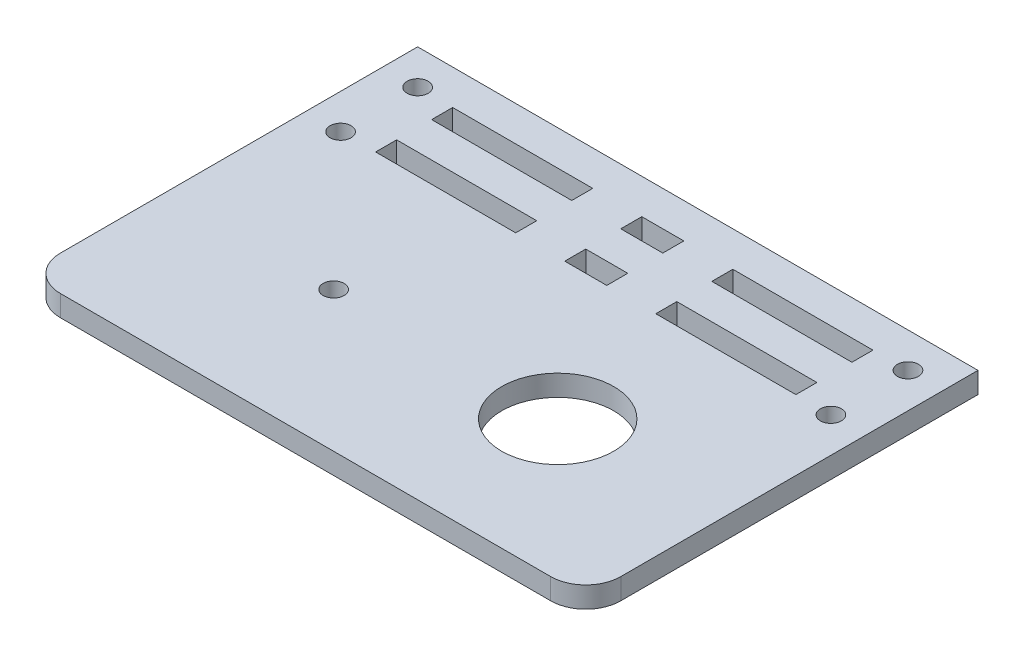
ISO-10303-21;
HEADER;
FILE_DESCRIPTION(('STEP AP214'),'2;1');
FILE_NAME('part.step','',(''),(''),'','','');
FILE_SCHEMA(('AUTOMOTIVE_DESIGN { 1 0 10303 214 1 1 1 1 }'));
ENDSEC;
DATA;
#1=APPLICATION_CONTEXT('core data for automotive mechanical design processes');
#2=APPLICATION_PROTOCOL_DEFINITION('international standard','automotive_design',2000,#1);
#3=PRODUCT_CONTEXT('',#1,'mechanical');
#4=PRODUCT('Part','Part','',(#3));
#5=PRODUCT_RELATED_PRODUCT_CATEGORY('part','',(#4));
#6=PRODUCT_DEFINITION_FORMATION('','',#4);
#7=PRODUCT_DEFINITION_CONTEXT('part definition',#1,'design');
#8=PRODUCT_DEFINITION('design','',#6,#7);
#9=PRODUCT_DEFINITION_SHAPE('','',#8);
#10=(LENGTH_UNIT() NAMED_UNIT(*) SI_UNIT(.MILLI.,.METRE.));
#11=(NAMED_UNIT(*) PLANE_ANGLE_UNIT() SI_UNIT($,.RADIAN.));
#12=(NAMED_UNIT(*) SI_UNIT($,.STERADIAN.) SOLID_ANGLE_UNIT());
#13=UNCERTAINTY_MEASURE_WITH_UNIT(LENGTH_MEASURE(1.E-05),#10,'distance_accuracy_value','');
#14=(GEOMETRIC_REPRESENTATION_CONTEXT(3) GLOBAL_UNCERTAINTY_ASSIGNED_CONTEXT((#13)) GLOBAL_UNIT_ASSIGNED_CONTEXT((#10,
#11,#12)) REPRESENTATION_CONTEXT('',''));
#15=CARTESIAN_POINT('',(0.,0.,0.));
#16=DIRECTION('',(0.,0.,1.));
#17=DIRECTION('',(1.,0.,0.));
#18=AXIS2_PLACEMENT_3D('',#15,#16,#17);
#19=CARTESIAN_POINT('',(-40.,3.,0.));
#20=DIRECTION('',(1.,0.,0.));
#21=DIRECTION('',(0.,0.,-1.));
#22=AXIS2_PLACEMENT_3D('',#19,#20,#21);
#23=PLANE('',#22);
#24=DIRECTION('',(0.,0.,1.));
#25=VECTOR('',#24,1.);
#26=CARTESIAN_POINT('',(-40.,0.,0.));
#27=LINE('',#26,#25);
#28=CARTESIAN_POINT('',(-40.,0.,-36.));
#29=VERTEX_POINT('',#28);
#30=CARTESIAN_POINT('',(-40.,0.,15.));
#31=VERTEX_POINT('',#30);
#32=EDGE_CURVE('E364',#29,#31,#27,.T.);
#33=ORIENTED_EDGE('',*,*,#32,.T.);
#34=DIRECTION('',(0.,-1.,0.));
#35=VECTOR('',#34,1.);
#36=CARTESIAN_POINT('',(-40.,3.,15.));
#37=LINE('',#36,#35);
#38=CARTESIAN_POINT('',(-40.,3.,15.));
#39=VERTEX_POINT('',#38);
#40=EDGE_CURVE('E11',#39,#31,#37,.T.);
#41=ORIENTED_EDGE('',*,*,#40,.F.);
#42=DIRECTION('',(0.,0.,1.));
#43=VECTOR('',#42,1.);
#44=CARTESIAN_POINT('',(-40.,3.,0.));
#45=LINE('',#44,#43);
#46=CARTESIAN_POINT('',(-40.,3.,-36.));
#47=VERTEX_POINT('',#46);
#48=EDGE_CURVE('E704',#47,#39,#45,.T.);
#49=ORIENTED_EDGE('',*,*,#48,.F.);
#50=DIRECTION('',(0.,-1.,0.));
#51=VECTOR('',#50,1.);
#52=CARTESIAN_POINT('',(-40.,3.,-36.));
#53=LINE('',#52,#51);
#54=EDGE_CURVE('E57',#47,#29,#53,.T.);
#55=ORIENTED_EDGE('',*,*,#54,.T.);
#56=EDGE_LOOP('',(#33,#41,#49,#55));
#57=FACE_BOUND('',#56,.T.);
#58=ADVANCED_FACE('F38',(#57),#23,.F.);
#59=CARTESIAN_POINT('',(-35.,3.,15.));
#60=DIRECTION('',(0.,-1.,0.));
#61=DIRECTION('',(0.,0.,-1.));
#62=AXIS2_PLACEMENT_3D('',#59,#60,#61);
#63=CYLINDRICAL_SURFACE('',#62,5.);
#64=CARTESIAN_POINT('',(-35.,0.,15.));
#65=DIRECTION('',(0.,1.,0.));
#66=DIRECTION('',(0.,0.,1.));
#67=AXIS2_PLACEMENT_3D('',#64,#65,#66);
#68=CIRCLE('',#67,5.);
#69=CARTESIAN_POINT('',(-35.,0.,20.));
#70=VERTEX_POINT('',#69);
#71=EDGE_CURVE('E366',#31,#70,#68,.T.);
#72=ORIENTED_EDGE('',*,*,#71,.T.);
#73=DIRECTION('',(0.,-1.,0.));
#74=VECTOR('',#73,1.);
#75=CARTESIAN_POINT('',(-35.,3.,20.));
#76=LINE('',#75,#74);
#77=CARTESIAN_POINT('',(-35.,3.,20.));
#78=VERTEX_POINT('',#77);
#79=EDGE_CURVE('E48',#78,#70,#76,.T.);
#80=ORIENTED_EDGE('',*,*,#79,.F.);
#81=CARTESIAN_POINT('',(-35.,3.,15.));
#82=DIRECTION('',(0.,1.,0.));
#83=DIRECTION('',(0.,0.,1.));
#84=AXIS2_PLACEMENT_3D('',#81,#82,#83);
#85=CIRCLE('',#84,5.);
#86=EDGE_CURVE('E705',#39,#78,#85,.T.);
#87=ORIENTED_EDGE('',*,*,#86,.F.);
#88=ORIENTED_EDGE('',*,*,#40,.T.);
#89=EDGE_LOOP('',(#72,#80,#87,#88));
#90=FACE_BOUND('',#89,.T.);
#91=ADVANCED_FACE('F463',(#90),#63,.T.);
#92=CARTESIAN_POINT('',(0.,3.,20.));
#93=DIRECTION('',(0.,0.,-1.));
#94=DIRECTION('',(-1.,0.,0.));
#95=AXIS2_PLACEMENT_3D('',#92,#93,#94);
#96=PLANE('',#95);
#97=DIRECTION('',(1.,0.,0.));
#98=VECTOR('',#97,1.);
#99=CARTESIAN_POINT('',(0.,0.,20.));
#100=LINE('',#99,#98);
#101=CARTESIAN_POINT('',(35.,0.,20.));
#102=VERTEX_POINT('',#101);
#103=EDGE_CURVE('E368',#70,#102,#100,.T.);
#104=ORIENTED_EDGE('',*,*,#103,.T.);
#105=DIRECTION('',(0.,-1.,0.));
#106=VECTOR('',#105,1.);
#107=CARTESIAN_POINT('',(35.,3.,20.));
#108=LINE('',#107,#106);
#109=CARTESIAN_POINT('',(35.,3.,20.));
#110=VERTEX_POINT('',#109);
#111=EDGE_CURVE('E265',#110,#102,#108,.T.);
#112=ORIENTED_EDGE('',*,*,#111,.F.);
#113=DIRECTION('',(1.,0.,0.));
#114=VECTOR('',#113,1.);
#115=CARTESIAN_POINT('',(0.,3.,20.));
#116=LINE('',#115,#114);
#117=EDGE_CURVE('E253',#78,#110,#116,.T.);
#118=ORIENTED_EDGE('',*,*,#117,.F.);
#119=ORIENTED_EDGE('',*,*,#79,.T.);
#120=EDGE_LOOP('',(#104,#112,#118,#119));
#121=FACE_BOUND('',#120,.T.);
#122=ADVANCED_FACE('F468',(#121),#96,.F.);
#123=CARTESIAN_POINT('',(35.,3.,15.));
#124=DIRECTION('',(0.,-1.,0.));
#125=DIRECTION('',(0.,0.,-1.));
#126=AXIS2_PLACEMENT_3D('',#123,#124,#125);
#127=CYLINDRICAL_SURFACE('',#126,5.);
#128=CARTESIAN_POINT('',(35.,0.,15.));
#129=DIRECTION('',(0.,1.,0.));
#130=DIRECTION('',(0.,0.,1.));
#131=AXIS2_PLACEMENT_3D('',#128,#129,#130);
#132=CIRCLE('',#131,5.);
#133=CARTESIAN_POINT('',(40.,0.,15.));
#134=VERTEX_POINT('',#133);
#135=EDGE_CURVE('E262',#102,#134,#132,.T.);
#136=ORIENTED_EDGE('',*,*,#135,.T.);
#137=DIRECTION('',(0.,-1.,0.));
#138=VECTOR('',#137,1.);
#139=CARTESIAN_POINT('',(40.,3.,15.));
#140=LINE('',#139,#138);
#141=CARTESIAN_POINT('',(40.,3.,15.));
#142=VERTEX_POINT('',#141);
#143=EDGE_CURVE('E259',#142,#134,#140,.T.);
#144=ORIENTED_EDGE('',*,*,#143,.F.);
#145=CARTESIAN_POINT('',(35.,3.,15.));
#146=DIRECTION('',(0.,1.,0.));
#147=DIRECTION('',(0.,0.,1.));
#148=AXIS2_PLACEMENT_3D('',#145,#146,#147);
#149=CIRCLE('',#148,5.);
#150=EDGE_CURVE('E244',#110,#142,#149,.T.);
#151=ORIENTED_EDGE('',*,*,#150,.F.);
#152=ORIENTED_EDGE('',*,*,#111,.T.);
#153=EDGE_LOOP('',(#136,#144,#151,#152));
#154=FACE_BOUND('',#153,.T.);
#155=ADVANCED_FACE('F260',(#154),#127,.T.);
#156=CARTESIAN_POINT('',(40.,3.,0.));
#157=DIRECTION('',(1.,0.,0.));
#158=DIRECTION('',(0.,0.,-1.));
#159=AXIS2_PLACEMENT_3D('',#156,#157,#158);
#160=PLANE('',#159);
#161=DIRECTION('',(0.,0.,1.));
#162=VECTOR('',#161,1.);
#163=CARTESIAN_POINT('',(40.,0.,0.));
#164=LINE('',#163,#162);
#165=CARTESIAN_POINT('',(40.,0.,-36.));
#166=VERTEX_POINT('',#165);
#167=EDGE_CURVE('E371',#166,#134,#164,.T.);
#168=ORIENTED_EDGE('',*,*,#167,.F.);
#169=DIRECTION('',(0.,-1.,0.));
#170=VECTOR('',#169,1.);
#171=CARTESIAN_POINT('',(40.,3.,-36.));
#172=LINE('',#171,#170);
#173=CARTESIAN_POINT('',(40.,3.,-36.));
#174=VERTEX_POINT('',#173);
#175=EDGE_CURVE('E149',#174,#166,#172,.T.);
#176=ORIENTED_EDGE('',*,*,#175,.F.);
#177=DIRECTION('',(0.,0.,1.));
#178=VECTOR('',#177,1.);
#179=CARTESIAN_POINT('',(40.,3.,0.));
#180=LINE('',#179,#178);
#181=EDGE_CURVE('E251',#174,#142,#180,.T.);
#182=ORIENTED_EDGE('',*,*,#181,.T.);
#183=ORIENTED_EDGE('',*,*,#143,.T.);
#184=EDGE_LOOP('',(#168,#176,#182,#183));
#185=FACE_BOUND('',#184,.T.);
#186=ADVANCED_FACE('F267',(#185),#160,.T.);
#187=CARTESIAN_POINT('',(0.,3.,-20.));
#188=DIRECTION('',(0.,0.,-1.));
#189=DIRECTION('',(-1.,0.,0.));
#190=AXIS2_PLACEMENT_3D('',#187,#188,#189);
#191=PLANE('',#190);
#192=DIRECTION('',(1.,0.,0.));
#193=VECTOR('',#192,1.);
#194=CARTESIAN_POINT('',(0.,0.,-20.));
#195=LINE('',#194,#193);
#196=CARTESIAN_POINT('',(10.,0.,-20.));
#197=VERTEX_POINT('',#196);
#198=CARTESIAN_POINT('',(30.,0.,-20.));
#199=VERTEX_POINT('',#198);
#200=EDGE_CURVE('E346',#197,#199,#195,.T.);
#201=ORIENTED_EDGE('',*,*,#200,.F.);
#202=DIRECTION('',(0.,-1.,0.));
#203=VECTOR('',#202,1.);
#204=CARTESIAN_POINT('',(10.,3.,-20.));
#205=LINE('',#204,#203);
#206=CARTESIAN_POINT('',(10.,3.,-20.));
#207=VERTEX_POINT('',#206);
#208=EDGE_CURVE('E381',#207,#197,#205,.T.);
#209=ORIENTED_EDGE('',*,*,#208,.F.);
#210=DIRECTION('',(1.,0.,0.));
#211=VECTOR('',#210,1.);
#212=CARTESIAN_POINT('',(0.,3.,-20.));
#213=LINE('',#212,#211);
#214=CARTESIAN_POINT('',(30.,3.,-20.));
#215=VERTEX_POINT('',#214);
#216=EDGE_CURVE('E723',#207,#215,#213,.T.);
#217=ORIENTED_EDGE('',*,*,#216,.T.);
#218=DIRECTION('',(0.,-1.,0.));
#219=VECTOR('',#218,1.);
#220=CARTESIAN_POINT('',(30.,3.,-20.));
#221=LINE('',#220,#219);
#222=EDGE_CURVE('E386',#215,#199,#221,.T.);
#223=ORIENTED_EDGE('',*,*,#222,.T.);
#224=EDGE_LOOP('',(#201,#209,#217,#223));
#225=FACE_BOUND('',#224,.T.);
#226=ADVANCED_FACE('F493',(#225),#191,.T.);
#227=CARTESIAN_POINT('',(10.,3.,0.));
#228=DIRECTION('',(1.,0.,0.));
#229=DIRECTION('',(0.,0.,-1.));
#230=AXIS2_PLACEMENT_3D('',#227,#228,#229);
#231=PLANE('',#230);
#232=DIRECTION('',(0.,0.,1.));
#233=VECTOR('',#232,1.);
#234=CARTESIAN_POINT('',(10.,0.,0.));
#235=LINE('',#234,#233);
#236=CARTESIAN_POINT('',(10.,0.,-23.));
#237=VERTEX_POINT('',#236);
#238=EDGE_CURVE('E349',#237,#197,#235,.T.);
#239=ORIENTED_EDGE('',*,*,#238,.F.);
#240=DIRECTION('',(0.,-1.,0.));
#241=VECTOR('',#240,1.);
#242=CARTESIAN_POINT('',(10.,3.,-23.));
#243=LINE('',#242,#241);
#244=CARTESIAN_POINT('',(10.,3.,-23.));
#245=VERTEX_POINT('',#244);
#246=EDGE_CURVE('E391',#245,#237,#243,.T.);
#247=ORIENTED_EDGE('',*,*,#246,.F.);
#248=DIRECTION('',(0.,0.,1.));
#249=VECTOR('',#248,1.);
#250=CARTESIAN_POINT('',(10.,3.,0.));
#251=LINE('',#250,#249);
#252=EDGE_CURVE('E720',#245,#207,#251,.T.);
#253=ORIENTED_EDGE('',*,*,#252,.T.);
#254=ORIENTED_EDGE('',*,*,#208,.T.);
#255=EDGE_LOOP('',(#239,#247,#253,#254));
#256=FACE_BOUND('',#255,.T.);
#257=ADVANCED_FACE('F489',(#256),#231,.T.);
#258=CARTESIAN_POINT('',(0.,3.,-23.));
#259=DIRECTION('',(0.,0.,1.));
#260=DIRECTION('',(1.,0.,0.));
#261=AXIS2_PLACEMENT_3D('',#258,#259,#260);
#262=PLANE('',#261);
#263=DIRECTION('',(-1.,0.,0.));
#264=VECTOR('',#263,1.);
#265=CARTESIAN_POINT('',(0.,0.,-23.));
#266=LINE('',#265,#264);
#267=CARTESIAN_POINT('',(30.,0.,-23.));
#268=VERTEX_POINT('',#267);
#269=EDGE_CURVE('E352',#268,#237,#266,.T.);
#270=ORIENTED_EDGE('',*,*,#269,.F.);
#271=DIRECTION('',(0.,-1.,0.));
#272=VECTOR('',#271,1.);
#273=CARTESIAN_POINT('',(30.,3.,-23.));
#274=LINE('',#273,#272);
#275=CARTESIAN_POINT('',(30.,3.,-23.));
#276=VERTEX_POINT('',#275);
#277=EDGE_CURVE('E388',#276,#268,#274,.T.);
#278=ORIENTED_EDGE('',*,*,#277,.F.);
#279=DIRECTION('',(-1.,0.,0.));
#280=VECTOR('',#279,1.);
#281=CARTESIAN_POINT('',(0.,3.,-23.));
#282=LINE('',#281,#280);
#283=EDGE_CURVE('E717',#276,#245,#282,.T.);
#284=ORIENTED_EDGE('',*,*,#283,.T.);
#285=ORIENTED_EDGE('',*,*,#246,.T.);
#286=EDGE_LOOP('',(#270,#278,#284,#285));
#287=FACE_BOUND('',#286,.T.);
#288=ADVANCED_FACE('F485',(#287),#262,.T.);
#289=CARTESIAN_POINT('',(0.,3.,-23.));
#290=DIRECTION('',(0.,0.,1.));
#291=DIRECTION('',(1.,0.,0.));
#292=AXIS2_PLACEMENT_3D('',#289,#290,#291);
#293=PLANE('',#292);
#294=DIRECTION('',(-1.,0.,0.));
#295=VECTOR('',#294,1.);
#296=CARTESIAN_POINT('',(0.,0.,-23.));
#297=LINE('',#296,#295);
#298=CARTESIAN_POINT('',(3.,0.,-23.));
#299=VERTEX_POINT('',#298);
#300=CARTESIAN_POINT('',(-3.,0.,-23.));
#301=VERTEX_POINT('',#300);
#302=EDGE_CURVE('E334',#299,#301,#297,.T.);
#303=ORIENTED_EDGE('',*,*,#302,.F.);
#304=DIRECTION('',(0.,-1.,0.));
#305=VECTOR('',#304,1.);
#306=CARTESIAN_POINT('',(3.,3.,-23.));
#307=LINE('',#306,#305);
#308=CARTESIAN_POINT('',(3.,3.,-23.));
#309=VERTEX_POINT('',#308);
#310=EDGE_CURVE('E389',#309,#299,#307,.T.);
#311=ORIENTED_EDGE('',*,*,#310,.F.);
#312=DIRECTION('',(-1.,0.,0.));
#313=VECTOR('',#312,1.);
#314=CARTESIAN_POINT('',(0.,3.,-23.));
#315=LINE('',#314,#313);
#316=CARTESIAN_POINT('',(-3.,3.,-23.));
#317=VERTEX_POINT('',#316);
#318=EDGE_CURVE('E735',#309,#317,#315,.T.);
#319=ORIENTED_EDGE('',*,*,#318,.T.);
#320=DIRECTION('',(0.,-1.,0.));
#321=VECTOR('',#320,1.);
#322=CARTESIAN_POINT('',(-3.,3.,-23.));
#323=LINE('',#322,#321);
#324=EDGE_CURVE('E394',#317,#301,#323,.T.);
#325=ORIENTED_EDGE('',*,*,#324,.T.);
#326=EDGE_LOOP('',(#303,#311,#319,#325));
#327=FACE_BOUND('',#326,.T.);
#328=ADVANCED_FACE('F488',(#327),#293,.T.);
#329=CARTESIAN_POINT('',(3.,3.,0.));
#330=DIRECTION('',(-1.,0.,0.));
#331=DIRECTION('',(0.,0.,1.));
#332=AXIS2_PLACEMENT_3D('',#329,#330,#331);
#333=PLANE('',#332);
#334=DIRECTION('',(0.,0.,-1.));
#335=VECTOR('',#334,1.);
#336=CARTESIAN_POINT('',(3.,0.,0.));
#337=LINE('',#336,#335);
#338=CARTESIAN_POINT('',(3.,0.,-20.));
#339=VERTEX_POINT('',#338);
#340=EDGE_CURVE('E337',#339,#299,#337,.T.);
#341=ORIENTED_EDGE('',*,*,#340,.F.);
#342=DIRECTION('',(0.,-1.,0.));
#343=VECTOR('',#342,1.);
#344=CARTESIAN_POINT('',(3.,3.,-20.));
#345=LINE('',#344,#343);
#346=CARTESIAN_POINT('',(3.,3.,-20.));
#347=VERTEX_POINT('',#346);
#348=EDGE_CURVE('E399',#347,#339,#345,.T.);
#349=ORIENTED_EDGE('',*,*,#348,.F.);
#350=DIRECTION('',(0.,0.,-1.));
#351=VECTOR('',#350,1.);
#352=CARTESIAN_POINT('',(3.,3.,0.));
#353=LINE('',#352,#351);
#354=EDGE_CURVE('E732',#347,#309,#353,.T.);
#355=ORIENTED_EDGE('',*,*,#354,.T.);
#356=ORIENTED_EDGE('',*,*,#310,.T.);
#357=EDGE_LOOP('',(#341,#349,#355,#356));
#358=FACE_BOUND('',#357,.T.);
#359=ADVANCED_FACE('F506',(#358),#333,.T.);
#360=CARTESIAN_POINT('',(0.,3.,-20.));
#361=DIRECTION('',(0.,0.,-1.));
#362=DIRECTION('',(-1.,0.,0.));
#363=AXIS2_PLACEMENT_3D('',#360,#361,#362);
#364=PLANE('',#363);
#365=DIRECTION('',(1.,0.,0.));
#366=VECTOR('',#365,1.);
#367=CARTESIAN_POINT('',(0.,0.,-20.));
#368=LINE('',#367,#366);
#369=CARTESIAN_POINT('',(-3.,0.,-20.));
#370=VERTEX_POINT('',#369);
#371=EDGE_CURVE('E340',#370,#339,#368,.T.);
#372=ORIENTED_EDGE('',*,*,#371,.F.);
#373=DIRECTION('',(0.,-1.,0.));
#374=VECTOR('',#373,1.);
#375=CARTESIAN_POINT('',(-3.,3.,-20.));
#376=LINE('',#375,#374);
#377=CARTESIAN_POINT('',(-3.,3.,-20.));
#378=VERTEX_POINT('',#377);
#379=EDGE_CURVE('E396',#378,#370,#376,.T.);
#380=ORIENTED_EDGE('',*,*,#379,.F.);
#381=DIRECTION('',(1.,0.,0.));
#382=VECTOR('',#381,1.);
#383=CARTESIAN_POINT('',(0.,3.,-20.));
#384=LINE('',#383,#382);
#385=EDGE_CURVE('E729',#378,#347,#384,.T.);
#386=ORIENTED_EDGE('',*,*,#385,.T.);
#387=ORIENTED_EDGE('',*,*,#348,.T.);
#388=EDGE_LOOP('',(#372,#380,#386,#387));
#389=FACE_BOUND('',#388,.T.);
#390=ADVANCED_FACE('F502',(#389),#364,.T.);
#391=CARTESIAN_POINT('',(0.,3.,-23.));
#392=DIRECTION('',(0.,0.,-1.));
#393=DIRECTION('',(-1.,0.,0.));
#394=AXIS2_PLACEMENT_3D('',#391,#392,#393);
#395=PLANE('',#394);
#396=DIRECTION('',(1.,0.,0.));
#397=VECTOR('',#396,1.);
#398=CARTESIAN_POINT('',(0.,0.,-23.));
#399=LINE('',#398,#397);
#400=CARTESIAN_POINT('',(-30.,0.,-23.));
#401=VERTEX_POINT('',#400);
#402=CARTESIAN_POINT('',(-10.,0.,-23.));
#403=VERTEX_POINT('',#402);
#404=EDGE_CURVE('E322',#401,#403,#399,.T.);
#405=ORIENTED_EDGE('',*,*,#404,.T.);
#406=DIRECTION('',(0.,-1.,0.));
#407=VECTOR('',#406,1.);
#408=CARTESIAN_POINT('',(-10.,3.,-23.));
#409=LINE('',#408,#407);
#410=CARTESIAN_POINT('',(-10.,3.,-23.));
#411=VERTEX_POINT('',#410);
#412=EDGE_CURVE('E397',#411,#403,#409,.T.);
#413=ORIENTED_EDGE('',*,*,#412,.F.);
#414=DIRECTION('',(1.,0.,0.));
#415=VECTOR('',#414,1.);
#416=CARTESIAN_POINT('',(0.,3.,-23.));
#417=LINE('',#416,#415);
#418=CARTESIAN_POINT('',(-30.,3.,-23.));
#419=VERTEX_POINT('',#418);
#420=EDGE_CURVE('E746',#419,#411,#417,.T.);
#421=ORIENTED_EDGE('',*,*,#420,.F.);
#422=DIRECTION('',(0.,-1.,0.));
#423=VECTOR('',#422,1.);
#424=CARTESIAN_POINT('',(-30.,3.,-23.));
#425=LINE('',#424,#423);
#426=EDGE_CURVE('E402',#419,#401,#425,.T.);
#427=ORIENTED_EDGE('',*,*,#426,.T.);
#428=EDGE_LOOP('',(#405,#413,#421,#427));
#429=FACE_BOUND('',#428,.T.);
#430=ADVANCED_FACE('F505',(#429),#395,.F.);
#431=CARTESIAN_POINT('',(-10.,3.,0.));
#432=DIRECTION('',(1.,0.,0.));
#433=DIRECTION('',(0.,0.,-1.));
#434=AXIS2_PLACEMENT_3D('',#431,#432,#433);
#435=PLANE('',#434);
#436=DIRECTION('',(0.,0.,1.));
#437=VECTOR('',#436,1.);
#438=CARTESIAN_POINT('',(-10.,0.,0.));
#439=LINE('',#438,#437);
#440=CARTESIAN_POINT('',(-10.,0.,-20.));
#441=VERTEX_POINT('',#440);
#442=EDGE_CURVE('E325',#403,#441,#439,.T.);
#443=ORIENTED_EDGE('',*,*,#442,.T.);
#444=DIRECTION('',(0.,-1.,0.));
#445=VECTOR('',#444,1.);
#446=CARTESIAN_POINT('',(-10.,3.,-20.));
#447=LINE('',#446,#445);
#448=CARTESIAN_POINT('',(-10.,3.,-20.));
#449=VERTEX_POINT('',#448);
#450=EDGE_CURVE('E407',#449,#441,#447,.T.);
#451=ORIENTED_EDGE('',*,*,#450,.F.);
#452=DIRECTION('',(0.,0.,1.));
#453=VECTOR('',#452,1.);
#454=CARTESIAN_POINT('',(-10.,3.,0.));
#455=LINE('',#454,#453);
#456=EDGE_CURVE('E744',#411,#449,#455,.T.);
#457=ORIENTED_EDGE('',*,*,#456,.F.);
#458=ORIENTED_EDGE('',*,*,#412,.T.);
#459=EDGE_LOOP('',(#443,#451,#457,#458));
#460=FACE_BOUND('',#459,.T.);
#461=ADVANCED_FACE('F522',(#460),#435,.F.);
#462=CARTESIAN_POINT('',(0.,3.,-20.));
#463=DIRECTION('',(0.,0.,-1.));
#464=DIRECTION('',(-1.,0.,0.));
#465=AXIS2_PLACEMENT_3D('',#462,#463,#464);
#466=PLANE('',#465);
#467=DIRECTION('',(1.,0.,0.));
#468=VECTOR('',#467,1.);
#469=CARTESIAN_POINT('',(0.,0.,-20.));
#470=LINE('',#469,#468);
#471=CARTESIAN_POINT('',(-30.,0.,-20.));
#472=VERTEX_POINT('',#471);
#473=EDGE_CURVE('E328',#472,#441,#470,.T.);
#474=ORIENTED_EDGE('',*,*,#473,.F.);
#475=DIRECTION('',(0.,-1.,0.));
#476=VECTOR('',#475,1.);
#477=CARTESIAN_POINT('',(-30.,3.,-20.));
#478=LINE('',#477,#476);
#479=CARTESIAN_POINT('',(-30.,3.,-20.));
#480=VERTEX_POINT('',#479);
#481=EDGE_CURVE('E404',#480,#472,#478,.T.);
#482=ORIENTED_EDGE('',*,*,#481,.F.);
#483=DIRECTION('',(1.,0.,0.));
#484=VECTOR('',#483,1.);
#485=CARTESIAN_POINT('',(0.,3.,-20.));
#486=LINE('',#485,#484);
#487=EDGE_CURVE('E741',#480,#449,#486,.T.);
#488=ORIENTED_EDGE('',*,*,#487,.T.);
#489=ORIENTED_EDGE('',*,*,#450,.T.);
#490=EDGE_LOOP('',(#474,#482,#488,#489));
#491=FACE_BOUND('',#490,.T.);
#492=ADVANCED_FACE('F518',(#491),#466,.T.);
#493=CARTESIAN_POINT('',(0.,3.,-28.));
#494=DIRECTION('',(0.,0.,-1.));
#495=DIRECTION('',(-1.,0.,0.));
#496=AXIS2_PLACEMENT_3D('',#493,#494,#495);
#497=PLANE('',#496);
#498=DIRECTION('',(1.,0.,0.));
#499=VECTOR('',#498,1.);
#500=CARTESIAN_POINT('',(0.,0.,-28.));
#501=LINE('',#500,#499);
#502=CARTESIAN_POINT('',(10.,0.,-28.));
#503=VERTEX_POINT('',#502);
#504=CARTESIAN_POINT('',(30.,0.,-28.));
#505=VERTEX_POINT('',#504);
#506=EDGE_CURVE('E310',#503,#505,#501,.T.);
#507=ORIENTED_EDGE('',*,*,#506,.F.);
#508=DIRECTION('',(0.,-1.,0.));
#509=VECTOR('',#508,1.);
#510=CARTESIAN_POINT('',(10.,3.,-28.));
#511=LINE('',#510,#509);
#512=CARTESIAN_POINT('',(10.,3.,-28.));
#513=VERTEX_POINT('',#512);
#514=EDGE_CURVE('E405',#513,#503,#511,.T.);
#515=ORIENTED_EDGE('',*,*,#514,.F.);
#516=DIRECTION('',(1.,0.,0.));
#517=VECTOR('',#516,1.);
#518=CARTESIAN_POINT('',(0.,3.,-28.));
#519=LINE('',#518,#517);
#520=CARTESIAN_POINT('',(30.,3.,-28.));
#521=VERTEX_POINT('',#520);
#522=EDGE_CURVE('E757',#513,#521,#519,.T.);
#523=ORIENTED_EDGE('',*,*,#522,.T.);
#524=DIRECTION('',(0.,-1.,0.));
#525=VECTOR('',#524,1.);
#526=CARTESIAN_POINT('',(30.,3.,-28.));
#527=LINE('',#526,#525);
#528=EDGE_CURVE('E411',#521,#505,#527,.T.);
#529=ORIENTED_EDGE('',*,*,#528,.T.);
#530=EDGE_LOOP('',(#507,#515,#523,#529));
#531=FACE_BOUND('',#530,.T.);
#532=ADVANCED_FACE('F521',(#531),#497,.T.);
#533=CARTESIAN_POINT('',(10.,3.,0.));
#534=DIRECTION('',(-1.,0.,0.));
#535=DIRECTION('',(0.,0.,1.));
#536=AXIS2_PLACEMENT_3D('',#533,#534,#535);
#537=PLANE('',#536);
#538=DIRECTION('',(0.,0.,-1.));
#539=VECTOR('',#538,1.);
#540=CARTESIAN_POINT('',(10.,0.,0.));
#541=LINE('',#540,#539);
#542=CARTESIAN_POINT('',(10.,0.,-31.));
#543=VERTEX_POINT('',#542);
#544=EDGE_CURVE('E313',#503,#543,#541,.T.);
#545=ORIENTED_EDGE('',*,*,#544,.T.);
#546=DIRECTION('',(0.,-1.,0.));
#547=VECTOR('',#546,1.);
#548=CARTESIAN_POINT('',(10.,3.,-31.));
#549=LINE('',#548,#547);
#550=CARTESIAN_POINT('',(10.,3.,-31.));
#551=VERTEX_POINT('',#550);
#552=EDGE_CURVE('E416',#551,#543,#549,.T.);
#553=ORIENTED_EDGE('',*,*,#552,.F.);
#554=DIRECTION('',(0.,0.,-1.));
#555=VECTOR('',#554,1.);
#556=CARTESIAN_POINT('',(10.,3.,0.));
#557=LINE('',#556,#555);
#558=EDGE_CURVE('E754',#513,#551,#557,.T.);
#559=ORIENTED_EDGE('',*,*,#558,.F.);
#560=ORIENTED_EDGE('',*,*,#514,.T.);
#561=EDGE_LOOP('',(#545,#553,#559,#560));
#562=FACE_BOUND('',#561,.T.);
#563=ADVANCED_FACE('F538',(#562),#537,.F.);
#564=CARTESIAN_POINT('',(0.,3.,-31.));
#565=DIRECTION('',(0.,0.,-1.));
#566=DIRECTION('',(-1.,0.,0.));
#567=AXIS2_PLACEMENT_3D('',#564,#565,#566);
#568=PLANE('',#567);
#569=DIRECTION('',(1.,0.,0.));
#570=VECTOR('',#569,1.);
#571=CARTESIAN_POINT('',(0.,0.,-31.));
#572=LINE('',#571,#570);
#573=CARTESIAN_POINT('',(30.,0.,-31.));
#574=VERTEX_POINT('',#573);
#575=EDGE_CURVE('E316',#543,#574,#572,.T.);
#576=ORIENTED_EDGE('',*,*,#575,.T.);
#577=DIRECTION('',(0.,-1.,0.));
#578=VECTOR('',#577,1.);
#579=CARTESIAN_POINT('',(30.,3.,-31.));
#580=LINE('',#579,#578);
#581=CARTESIAN_POINT('',(30.,3.,-31.));
#582=VERTEX_POINT('',#581);
#583=EDGE_CURVE('E413',#582,#574,#580,.T.);
#584=ORIENTED_EDGE('',*,*,#583,.F.);
#585=DIRECTION('',(1.,0.,0.));
#586=VECTOR('',#585,1.);
#587=CARTESIAN_POINT('',(0.,3.,-31.));
#588=LINE('',#587,#586);
#589=EDGE_CURVE('E752',#551,#582,#588,.T.);
#590=ORIENTED_EDGE('',*,*,#589,.F.);
#591=ORIENTED_EDGE('',*,*,#552,.T.);
#592=EDGE_LOOP('',(#576,#584,#590,#591));
#593=FACE_BOUND('',#592,.T.);
#594=ADVANCED_FACE('F534',(#593),#568,.F.);
#595=CARTESIAN_POINT('',(0.,3.,-28.));
#596=DIRECTION('',(0.,0.,1.));
#597=DIRECTION('',(1.,0.,0.));
#598=AXIS2_PLACEMENT_3D('',#595,#596,#597);
#599=PLANE('',#598);
#600=DIRECTION('',(-1.,0.,0.));
#601=VECTOR('',#600,1.);
#602=CARTESIAN_POINT('',(0.,0.,-28.));
#603=LINE('',#602,#601);
#604=CARTESIAN_POINT('',(-10.,0.,-28.));
#605=VERTEX_POINT('',#604);
#606=CARTESIAN_POINT('',(-30.,0.,-28.));
#607=VERTEX_POINT('',#606);
#608=EDGE_CURVE('E298',#605,#607,#603,.T.);
#609=ORIENTED_EDGE('',*,*,#608,.T.);
#610=DIRECTION('',(0.,-1.,0.));
#611=VECTOR('',#610,1.);
#612=CARTESIAN_POINT('',(-30.,3.,-28.));
#613=LINE('',#612,#611);
#614=CARTESIAN_POINT('',(-30.,3.,-28.));
#615=VERTEX_POINT('',#614);
#616=EDGE_CURVE('E414',#615,#607,#613,.T.);
#617=ORIENTED_EDGE('',*,*,#616,.F.);
#618=DIRECTION('',(-1.,0.,0.));
#619=VECTOR('',#618,1.);
#620=CARTESIAN_POINT('',(0.,3.,-28.));
#621=LINE('',#620,#619);
#622=CARTESIAN_POINT('',(-10.,3.,-28.));
#623=VERTEX_POINT('',#622);
#624=EDGE_CURVE('E768',#623,#615,#621,.T.);
#625=ORIENTED_EDGE('',*,*,#624,.F.);
#626=DIRECTION('',(0.,-1.,0.));
#627=VECTOR('',#626,1.);
#628=CARTESIAN_POINT('',(-10.,3.,-28.));
#629=LINE('',#628,#627);
#630=EDGE_CURVE('E420',#623,#605,#629,.T.);
#631=ORIENTED_EDGE('',*,*,#630,.T.);
#632=EDGE_LOOP('',(#609,#617,#625,#631));
#633=FACE_BOUND('',#632,.T.);
#634=ADVANCED_FACE('F537',(#633),#599,.F.);
#635=CARTESIAN_POINT('',(-30.,3.,0.));
#636=DIRECTION('',(-1.,0.,0.));
#637=DIRECTION('',(0.,0.,1.));
#638=AXIS2_PLACEMENT_3D('',#635,#636,#637);
#639=PLANE('',#638);
#640=DIRECTION('',(0.,0.,-1.));
#641=VECTOR('',#640,1.);
#642=CARTESIAN_POINT('',(-30.,0.,0.));
#643=LINE('',#642,#641);
#644=CARTESIAN_POINT('',(-30.,0.,-31.));
#645=VERTEX_POINT('',#644);
#646=EDGE_CURVE('E301',#607,#645,#643,.T.);
#647=ORIENTED_EDGE('',*,*,#646,.T.);
#648=DIRECTION('',(0.,-1.,0.));
#649=VECTOR('',#648,1.);
#650=CARTESIAN_POINT('',(-30.,3.,-31.));
#651=LINE('',#650,#649);
#652=CARTESIAN_POINT('',(-30.,3.,-31.));
#653=VERTEX_POINT('',#652);
#654=EDGE_CURVE('E424',#653,#645,#651,.T.);
#655=ORIENTED_EDGE('',*,*,#654,.F.);
#656=DIRECTION('',(0.,0.,-1.));
#657=VECTOR('',#656,1.);
#658=CARTESIAN_POINT('',(-30.,3.,0.));
#659=LINE('',#658,#657);
#660=EDGE_CURVE('E766',#615,#653,#659,.T.);
#661=ORIENTED_EDGE('',*,*,#660,.F.);
#662=ORIENTED_EDGE('',*,*,#616,.T.);
#663=EDGE_LOOP('',(#647,#655,#661,#662));
#664=FACE_BOUND('',#663,.T.);
#665=ADVANCED_FACE('F552',(#664),#639,.F.);
#666=CARTESIAN_POINT('',(0.,3.,-31.));
#667=DIRECTION('',(0.,0.,1.));
#668=DIRECTION('',(1.,0.,0.));
#669=AXIS2_PLACEMENT_3D('',#666,#667,#668);
#670=PLANE('',#669);
#671=DIRECTION('',(-1.,0.,0.));
#672=VECTOR('',#671,1.);
#673=CARTESIAN_POINT('',(0.,0.,-31.));
#674=LINE('',#673,#672);
#675=CARTESIAN_POINT('',(-10.,0.,-31.));
#676=VERTEX_POINT('',#675);
#677=EDGE_CURVE('E304',#676,#645,#674,.T.);
#678=ORIENTED_EDGE('',*,*,#677,.F.);
#679=DIRECTION('',(0.,-1.,0.));
#680=VECTOR('',#679,1.);
#681=CARTESIAN_POINT('',(-10.,3.,-31.));
#682=LINE('',#681,#680);
#683=CARTESIAN_POINT('',(-10.,3.,-31.));
#684=VERTEX_POINT('',#683);
#685=EDGE_CURVE('E422',#684,#676,#682,.T.);
#686=ORIENTED_EDGE('',*,*,#685,.F.);
#687=DIRECTION('',(-1.,0.,0.));
#688=VECTOR('',#687,1.);
#689=CARTESIAN_POINT('',(0.,3.,-31.));
#690=LINE('',#689,#688);
#691=EDGE_CURVE('E763',#684,#653,#690,.T.);
#692=ORIENTED_EDGE('',*,*,#691,.T.);
#693=ORIENTED_EDGE('',*,*,#654,.T.);
#694=EDGE_LOOP('',(#678,#686,#692,#693));
#695=FACE_BOUND('',#694,.T.);
#696=ADVANCED_FACE('F549',(#695),#670,.T.);
#697=CARTESIAN_POINT('',(0.,3.,-28.));
#698=DIRECTION('',(0.,0.,1.));
#699=DIRECTION('',(1.,0.,0.));
#700=AXIS2_PLACEMENT_3D('',#697,#698,#699);
#701=PLANE('',#700);
#702=DIRECTION('',(-1.,0.,0.));
#703=VECTOR('',#702,1.);
#704=CARTESIAN_POINT('',(0.,0.,-28.));
#705=LINE('',#704,#703);
#706=CARTESIAN_POINT('',(3.,0.,-28.));
#707=VERTEX_POINT('',#706);
#708=CARTESIAN_POINT('',(-3.,0.,-28.));
#709=VERTEX_POINT('',#708);
#710=EDGE_CURVE('E286',#707,#709,#705,.T.);
#711=ORIENTED_EDGE('',*,*,#710,.T.);
#712=DIRECTION('',(0.,-1.,0.));
#713=VECTOR('',#712,1.);
#714=CARTESIAN_POINT('',(-3.,3.,-28.));
#715=LINE('',#714,#713);
#716=CARTESIAN_POINT('',(-3.,3.,-28.));
#717=VERTEX_POINT('',#716);
#718=EDGE_CURVE('E42',#717,#709,#715,.T.);
#719=ORIENTED_EDGE('',*,*,#718,.F.);
#720=DIRECTION('',(-1.,0.,0.));
#721=VECTOR('',#720,1.);
#722=CARTESIAN_POINT('',(0.,3.,-28.));
#723=LINE('',#722,#721);
#724=CARTESIAN_POINT('',(3.,3.,-28.));
#725=VERTEX_POINT('',#724);
#726=EDGE_CURVE('E775',#725,#717,#723,.T.);
#727=ORIENTED_EDGE('',*,*,#726,.F.);
#728=DIRECTION('',(0.,-1.,0.));
#729=VECTOR('',#728,1.);
#730=CARTESIAN_POINT('',(3.,3.,-28.));
#731=LINE('',#730,#729);
#732=EDGE_CURVE('E276',#725,#707,#731,.T.);
#733=ORIENTED_EDGE('',*,*,#732,.T.);
#734=EDGE_LOOP('',(#711,#719,#727,#733));
#735=FACE_BOUND('',#734,.T.);
#736=ADVANCED_FACE('F439',(#735),#701,.F.);
#737=CARTESIAN_POINT('',(-3.,3.,0.));
#738=DIRECTION('',(-1.,0.,0.));
#739=DIRECTION('',(0.,0.,1.));
#740=AXIS2_PLACEMENT_3D('',#737,#738,#739);
#741=PLANE('',#740);
#742=DIRECTION('',(0.,0.,-1.));
#743=VECTOR('',#742,1.);
#744=CARTESIAN_POINT('',(-3.,0.,0.));
#745=LINE('',#744,#743);
#746=CARTESIAN_POINT('',(-3.,0.,-31.));
#747=VERTEX_POINT('',#746);
#748=EDGE_CURVE('E289',#709,#747,#745,.T.);
#749=ORIENTED_EDGE('',*,*,#748,.T.);
#750=DIRECTION('',(0.,-1.,0.));
#751=VECTOR('',#750,1.);
#752=CARTESIAN_POINT('',(-3.,3.,-31.));
#753=LINE('',#752,#751);
#754=CARTESIAN_POINT('',(-3.,3.,-31.));
#755=VERTEX_POINT('',#754);
#756=EDGE_CURVE('E430',#755,#747,#753,.T.);
#757=ORIENTED_EDGE('',*,*,#756,.F.);
#758=DIRECTION('',(0.,0.,-1.));
#759=VECTOR('',#758,1.);
#760=CARTESIAN_POINT('',(-3.,3.,0.));
#761=LINE('',#760,#759);
#762=EDGE_CURVE('E162',#717,#755,#761,.T.);
#763=ORIENTED_EDGE('',*,*,#762,.F.);
#764=ORIENTED_EDGE('',*,*,#718,.T.);
#765=EDGE_LOOP('',(#749,#757,#763,#764));
#766=FACE_BOUND('',#765,.T.);
#767=ADVANCED_FACE('F435',(#766),#741,.F.);
#768=CARTESIAN_POINT('',(0.,3.,-31.));
#769=DIRECTION('',(0.,0.,1.));
#770=DIRECTION('',(1.,0.,0.));
#771=AXIS2_PLACEMENT_3D('',#768,#769,#770);
#772=PLANE('',#771);
#773=DIRECTION('',(-1.,0.,0.));
#774=VECTOR('',#773,1.);
#775=CARTESIAN_POINT('',(0.,0.,-31.));
#776=LINE('',#775,#774);
#777=CARTESIAN_POINT('',(3.,0.,-31.));
#778=VERTEX_POINT('',#777);
#779=EDGE_CURVE('E292',#778,#747,#776,.T.);
#780=ORIENTED_EDGE('',*,*,#779,.F.);
#781=DIRECTION('',(0.,-1.,0.));
#782=VECTOR('',#781,1.);
#783=CARTESIAN_POINT('',(3.,3.,-31.));
#784=LINE('',#783,#782);
#785=CARTESIAN_POINT('',(3.,3.,-31.));
#786=VERTEX_POINT('',#785);
#787=EDGE_CURVE('E429',#786,#778,#784,.T.);
#788=ORIENTED_EDGE('',*,*,#787,.F.);
#789=DIRECTION('',(-1.,0.,0.));
#790=VECTOR('',#789,1.);
#791=CARTESIAN_POINT('',(0.,3.,-31.));
#792=LINE('',#791,#790);
#793=EDGE_CURVE('E772',#786,#755,#792,.T.);
#794=ORIENTED_EDGE('',*,*,#793,.T.);
#795=ORIENTED_EDGE('',*,*,#756,.T.);
#796=EDGE_LOOP('',(#780,#788,#794,#795));
#797=FACE_BOUND('',#796,.T.);
#798=ADVANCED_FACE('F450',(#797),#772,.T.);
#799=CARTESIAN_POINT('',(0.,3.,-36.));
#800=DIRECTION('',(0.,0.,-1.));
#801=DIRECTION('',(-1.,0.,0.));
#802=AXIS2_PLACEMENT_3D('',#799,#800,#801);
#803=PLANE('',#802);
#804=DIRECTION('',(1.,0.,0.));
#805=VECTOR('',#804,1.);
#806=CARTESIAN_POINT('',(0.,0.,-36.));
#807=LINE('',#806,#805);
#808=EDGE_CURVE('E373',#29,#166,#807,.T.);
#809=ORIENTED_EDGE('',*,*,#808,.F.);
#810=ORIENTED_EDGE('',*,*,#54,.F.);
#811=DIRECTION('',(1.,0.,0.));
#812=VECTOR('',#811,1.);
#813=CARTESIAN_POINT('',(0.,3.,-36.));
#814=LINE('',#813,#812);
#815=EDGE_CURVE('E268',#47,#174,#814,.T.);
#816=ORIENTED_EDGE('',*,*,#815,.T.);
#817=ORIENTED_EDGE('',*,*,#175,.T.);
#818=EDGE_LOOP('',(#809,#810,#816,#817));
#819=FACE_BOUND('',#818,.T.);
#820=ADVANCED_FACE('F452',(#819),#803,.T.);
#821=CARTESIAN_POINT('',(-16.,3.,0.));
#822=DIRECTION('',(0.,-1.,0.));
#823=DIRECTION('',(0.,0.,-1.));
#824=AXIS2_PLACEMENT_3D('',#821,#822,#823);
#825=CYLINDRICAL_SURFACE('',#824,1.5);
#826=CARTESIAN_POINT('',(-16.,3.,0.));
#827=DIRECTION('',(0.,1.,0.));
#828=DIRECTION('',(0.,0.,1.));
#829=AXIS2_PLACEMENT_3D('',#826,#827,#828);
#830=CIRCLE('',#829,1.5);
#831=CARTESIAN_POINT('',(-16.,3.,1.5));
#832=VERTEX_POINT('',#831);
#833=EDGE_CURVE('E707',#832,#832,#830,.T.);
#834=ORIENTED_EDGE('',*,*,#833,.T.);
#835=EDGE_LOOP('',(#834));
#836=FACE_BOUND('',#835,.T.);
#837=CARTESIAN_POINT('',(-16.,0.,0.));
#838=DIRECTION('',(0.,1.,0.));
#839=DIRECTION('',(0.,0.,1.));
#840=AXIS2_PLACEMENT_3D('',#837,#838,#839);
#841=CIRCLE('',#840,1.5);
#842=CARTESIAN_POINT('',(-16.,0.,1.5));
#843=VERTEX_POINT('',#842);
#844=EDGE_CURVE('E361',#843,#843,#841,.T.);
#845=ORIENTED_EDGE('',*,*,#844,.F.);
#846=EDGE_LOOP('',(#845));
#847=FACE_BOUND('',#846,.T.);
#848=ADVANCED_FACE('F458',(#836,#847),#825,.F.);
#849=CARTESIAN_POINT('',(16.,3.,0.));
#850=DIRECTION('',(0.,-1.,0.));
#851=DIRECTION('',(0.,0.,-1.));
#852=AXIS2_PLACEMENT_3D('',#849,#850,#851);
#853=CYLINDRICAL_SURFACE('',#852,8.);
#854=CARTESIAN_POINT('',(16.,3.,0.));
#855=DIRECTION('',(0.,1.,0.));
#856=DIRECTION('',(0.,0.,1.));
#857=AXIS2_PLACEMENT_3D('',#854,#855,#856);
#858=CIRCLE('',#857,8.);
#859=CARTESIAN_POINT('',(16.,3.,8.));
#860=VERTEX_POINT('',#859);
#861=EDGE_CURVE('E710',#860,#860,#858,.T.);
#862=ORIENTED_EDGE('',*,*,#861,.T.);
#863=EDGE_LOOP('',(#862));
#864=FACE_BOUND('',#863,.T.);
#865=CARTESIAN_POINT('',(16.,0.,0.));
#866=DIRECTION('',(0.,1.,0.));
#867=DIRECTION('',(0.,0.,1.));
#868=AXIS2_PLACEMENT_3D('',#865,#866,#867);
#869=CIRCLE('',#868,8.);
#870=CARTESIAN_POINT('',(16.,0.,8.));
#871=VERTEX_POINT('',#870);
#872=EDGE_CURVE('E358',#871,#871,#869,.T.);
#873=ORIENTED_EDGE('',*,*,#872,.F.);
#874=EDGE_LOOP('',(#873));
#875=FACE_BOUND('',#874,.T.);
#876=ADVANCED_FACE('F475',(#864,#875),#853,.F.);
#877=CARTESIAN_POINT('',(30.,3.,0.));
#878=DIRECTION('',(1.,0.,0.));
#879=DIRECTION('',(0.,0.,-1.));
#880=AXIS2_PLACEMENT_3D('',#877,#878,#879);
#881=PLANE('',#880);
#882=DIRECTION('',(0.,0.,1.));
#883=VECTOR('',#882,1.);
#884=CARTESIAN_POINT('',(30.,0.,0.));
#885=LINE('',#884,#883);
#886=EDGE_CURVE('E355',#268,#199,#885,.T.);
#887=ORIENTED_EDGE('',*,*,#886,.T.);
#888=ORIENTED_EDGE('',*,*,#222,.F.);
#889=DIRECTION('',(0.,0.,1.));
#890=VECTOR('',#889,1.);
#891=CARTESIAN_POINT('',(30.,3.,0.));
#892=LINE('',#891,#890);
#893=EDGE_CURVE('E715',#276,#215,#892,.T.);
#894=ORIENTED_EDGE('',*,*,#893,.F.);
#895=ORIENTED_EDGE('',*,*,#277,.T.);
#896=EDGE_LOOP('',(#887,#888,#894,#895));
#897=FACE_BOUND('',#896,.T.);
#898=ADVANCED_FACE('F479',(#897),#881,.F.);
#899=CARTESIAN_POINT('',(-3.,3.,0.));
#900=DIRECTION('',(1.,0.,0.));
#901=DIRECTION('',(0.,0.,-1.));
#902=AXIS2_PLACEMENT_3D('',#899,#900,#901);
#903=PLANE('',#902);
#904=DIRECTION('',(0.,0.,1.));
#905=VECTOR('',#904,1.);
#906=CARTESIAN_POINT('',(-3.,0.,0.));
#907=LINE('',#906,#905);
#908=EDGE_CURVE('E343',#301,#370,#907,.T.);
#909=ORIENTED_EDGE('',*,*,#908,.F.);
#910=ORIENTED_EDGE('',*,*,#324,.F.);
#911=DIRECTION('',(0.,0.,1.));
#912=VECTOR('',#911,1.);
#913=CARTESIAN_POINT('',(-3.,3.,0.));
#914=LINE('',#913,#912);
#915=EDGE_CURVE('E726',#317,#378,#914,.T.);
#916=ORIENTED_EDGE('',*,*,#915,.T.);
#917=ORIENTED_EDGE('',*,*,#379,.T.);
#918=EDGE_LOOP('',(#909,#910,#916,#917));
#919=FACE_BOUND('',#918,.T.);
#920=ADVANCED_FACE('F483',(#919),#903,.T.);
#921=CARTESIAN_POINT('',(-30.,3.,0.));
#922=DIRECTION('',(1.,0.,0.));
#923=DIRECTION('',(0.,0.,-1.));
#924=AXIS2_PLACEMENT_3D('',#921,#922,#923);
#925=PLANE('',#924);
#926=DIRECTION('',(0.,0.,1.));
#927=VECTOR('',#926,1.);
#928=CARTESIAN_POINT('',(-30.,0.,0.));
#929=LINE('',#928,#927);
#930=EDGE_CURVE('E331',#401,#472,#929,.T.);
#931=ORIENTED_EDGE('',*,*,#930,.F.);
#932=ORIENTED_EDGE('',*,*,#426,.F.);
#933=DIRECTION('',(0.,0.,1.));
#934=VECTOR('',#933,1.);
#935=CARTESIAN_POINT('',(-30.,3.,0.));
#936=LINE('',#935,#934);
#937=EDGE_CURVE('E738',#419,#480,#936,.T.);
#938=ORIENTED_EDGE('',*,*,#937,.T.);
#939=ORIENTED_EDGE('',*,*,#481,.T.);
#940=EDGE_LOOP('',(#931,#932,#938,#939));
#941=FACE_BOUND('',#940,.T.);
#942=ADVANCED_FACE('F500',(#941),#925,.T.);
#943=CARTESIAN_POINT('',(30.,3.,0.));
#944=DIRECTION('',(-1.,0.,0.));
#945=DIRECTION('',(0.,0.,1.));
#946=AXIS2_PLACEMENT_3D('',#943,#944,#945);
#947=PLANE('',#946);
#948=DIRECTION('',(0.,0.,-1.));
#949=VECTOR('',#948,1.);
#950=CARTESIAN_POINT('',(30.,0.,0.));
#951=LINE('',#950,#949);
#952=EDGE_CURVE('E319',#505,#574,#951,.T.);
#953=ORIENTED_EDGE('',*,*,#952,.F.);
#954=ORIENTED_EDGE('',*,*,#528,.F.);
#955=DIRECTION('',(0.,0.,-1.));
#956=VECTOR('',#955,1.);
#957=CARTESIAN_POINT('',(30.,3.,0.));
#958=LINE('',#957,#956);
#959=EDGE_CURVE('E749',#521,#582,#958,.T.);
#960=ORIENTED_EDGE('',*,*,#959,.T.);
#961=ORIENTED_EDGE('',*,*,#583,.T.);
#962=EDGE_LOOP('',(#953,#954,#960,#961));
#963=FACE_BOUND('',#962,.T.);
#964=ADVANCED_FACE('F516',(#963),#947,.T.);
#965=CARTESIAN_POINT('',(-10.,3.,0.));
#966=DIRECTION('',(-1.,0.,0.));
#967=DIRECTION('',(0.,0.,1.));
#968=AXIS2_PLACEMENT_3D('',#965,#966,#967);
#969=PLANE('',#968);
#970=DIRECTION('',(0.,0.,-1.));
#971=VECTOR('',#970,1.);
#972=CARTESIAN_POINT('',(-10.,0.,0.));
#973=LINE('',#972,#971);
#974=EDGE_CURVE('E307',#605,#676,#973,.T.);
#975=ORIENTED_EDGE('',*,*,#974,.F.);
#976=ORIENTED_EDGE('',*,*,#630,.F.);
#977=DIRECTION('',(0.,0.,-1.));
#978=VECTOR('',#977,1.);
#979=CARTESIAN_POINT('',(-10.,3.,0.));
#980=LINE('',#979,#978);
#981=EDGE_CURVE('E760',#623,#684,#980,.T.);
#982=ORIENTED_EDGE('',*,*,#981,.T.);
#983=ORIENTED_EDGE('',*,*,#685,.T.);
#984=EDGE_LOOP('',(#975,#976,#982,#983));
#985=FACE_BOUND('',#984,.T.);
#986=ADVANCED_FACE('F532',(#985),#969,.T.);
#987=CARTESIAN_POINT('',(3.,3.,0.));
#988=DIRECTION('',(-1.,0.,0.));
#989=DIRECTION('',(0.,0.,1.));
#990=AXIS2_PLACEMENT_3D('',#987,#988,#989);
#991=PLANE('',#990);
#992=DIRECTION('',(0.,0.,-1.));
#993=VECTOR('',#992,1.);
#994=CARTESIAN_POINT('',(3.,0.,0.));
#995=LINE('',#994,#993);
#996=EDGE_CURVE('E295',#707,#778,#995,.T.);
#997=ORIENTED_EDGE('',*,*,#996,.F.);
#998=ORIENTED_EDGE('',*,*,#732,.F.);
#999=DIRECTION('',(0.,0.,-1.));
#1000=VECTOR('',#999,1.);
#1001=CARTESIAN_POINT('',(3.,3.,0.));
#1002=LINE('',#1001,#1000);
#1003=EDGE_CURVE('E448',#725,#786,#1002,.T.);
#1004=ORIENTED_EDGE('',*,*,#1003,.T.);
#1005=ORIENTED_EDGE('',*,*,#787,.T.);
#1006=EDGE_LOOP('',(#997,#998,#1004,#1005));
#1007=FACE_BOUND('',#1006,.T.);
#1008=ADVANCED_FACE('F445',(#1007),#991,.T.);
#1009=CARTESIAN_POINT('',(-35.,3.,-31.));
#1010=DIRECTION('',(0.,-1.,0.));
#1011=DIRECTION('',(0.,0.,-1.));
#1012=AXIS2_PLACEMENT_3D('',#1009,#1010,#1011);
#1013=CYLINDRICAL_SURFACE('',#1012,1.5);
#1014=CARTESIAN_POINT('',(-35.,3.,-31.));
#1015=DIRECTION('',(0.,1.,0.));
#1016=DIRECTION('',(0.,0.,1.));
#1017=AXIS2_PLACEMENT_3D('',#1014,#1015,#1016);
#1018=CIRCLE('',#1017,1.5);
#1019=CARTESIAN_POINT('',(-35.,3.,-29.5));
#1020=VERTEX_POINT('',#1019);
#1021=EDGE_CURVE('E777',#1020,#1020,#1018,.T.);
#1022=ORIENTED_EDGE('',*,*,#1021,.T.);
#1023=EDGE_LOOP('',(#1022));
#1024=FACE_BOUND('',#1023,.T.);
#1025=CARTESIAN_POINT('',(-35.,0.,-31.));
#1026=DIRECTION('',(0.,1.,0.));
#1027=DIRECTION('',(0.,0.,1.));
#1028=AXIS2_PLACEMENT_3D('',#1025,#1026,#1027);
#1029=CIRCLE('',#1028,1.5);
#1030=CARTESIAN_POINT('',(-35.,0.,-29.5));
#1031=VERTEX_POINT('',#1030);
#1032=EDGE_CURVE('E283',#1031,#1031,#1029,.T.);
#1033=ORIENTED_EDGE('',*,*,#1032,.F.);
#1034=EDGE_LOOP('',(#1033));
#1035=FACE_BOUND('',#1034,.T.);
#1036=ADVANCED_FACE('F560',(#1024,#1035),#1013,.F.);
#1037=CARTESIAN_POINT('',(-35.,3.,-20.));
#1038=DIRECTION('',(0.,-1.,0.));
#1039=DIRECTION('',(0.,0.,-1.));
#1040=AXIS2_PLACEMENT_3D('',#1037,#1038,#1039);
#1041=CYLINDRICAL_SURFACE('',#1040,1.5);
#1042=CARTESIAN_POINT('',(-35.,3.,-20.));
#1043=DIRECTION('',(0.,1.,0.));
#1044=DIRECTION('',(0.,0.,1.));
#1045=AXIS2_PLACEMENT_3D('',#1042,#1043,#1044);
#1046=CIRCLE('',#1045,1.5);
#1047=CARTESIAN_POINT('',(-35.,3.,-18.5));
#1048=VERTEX_POINT('',#1047);
#1049=EDGE_CURVE('E779',#1048,#1048,#1046,.T.);
#1050=ORIENTED_EDGE('',*,*,#1049,.T.);
#1051=EDGE_LOOP('',(#1050));
#1052=FACE_BOUND('',#1051,.T.);
#1053=CARTESIAN_POINT('',(-35.,0.,-20.));
#1054=DIRECTION('',(0.,1.,0.));
#1055=DIRECTION('',(0.,0.,1.));
#1056=AXIS2_PLACEMENT_3D('',#1053,#1054,#1055);
#1057=CIRCLE('',#1056,1.5);
#1058=CARTESIAN_POINT('',(-35.,0.,-18.5));
#1059=VERTEX_POINT('',#1058);
#1060=EDGE_CURVE('E280',#1059,#1059,#1057,.T.);
#1061=ORIENTED_EDGE('',*,*,#1060,.F.);
#1062=EDGE_LOOP('',(#1061));
#1063=FACE_BOUND('',#1062,.T.);
#1064=ADVANCED_FACE('F564',(#1052,#1063),#1041,.F.);
#1065=CARTESIAN_POINT('',(35.,3.,-20.));
#1066=DIRECTION('',(0.,-1.,0.));
#1067=DIRECTION('',(0.,0.,-1.));
#1068=AXIS2_PLACEMENT_3D('',#1065,#1066,#1067);
#1069=CYLINDRICAL_SURFACE('',#1068,1.5);
#1070=CARTESIAN_POINT('',(35.,3.,-20.));
#1071=DIRECTION('',(0.,1.,0.));
#1072=DIRECTION('',(0.,0.,1.));
#1073=AXIS2_PLACEMENT_3D('',#1070,#1071,#1072);
#1074=CIRCLE('',#1073,1.5);
#1075=CARTESIAN_POINT('',(35.,3.,-18.5));
#1076=VERTEX_POINT('',#1075);
#1077=EDGE_CURVE('E379',#1076,#1076,#1074,.F.);
#1078=ORIENTED_EDGE('',*,*,#1077,.F.);
#1079=EDGE_LOOP('',(#1078));
#1080=FACE_BOUND('',#1079,.T.);
#1081=CARTESIAN_POINT('',(35.,0.,-20.));
#1082=DIRECTION('',(0.,1.,0.));
#1083=DIRECTION('',(0.,0.,1.));
#1084=AXIS2_PLACEMENT_3D('',#1081,#1082,#1083);
#1085=CIRCLE('',#1084,1.5);
#1086=CARTESIAN_POINT('',(35.,0.,-18.5));
#1087=VERTEX_POINT('',#1086);
#1088=EDGE_CURVE('E277',#1087,#1087,#1085,.F.);
#1089=ORIENTED_EDGE('',*,*,#1088,.T.);
#1090=EDGE_LOOP('',(#1089));
#1091=FACE_BOUND('',#1090,.T.);
#1092=ADVANCED_FACE('F40',(#1080,#1091),#1069,.F.);
#1093=CARTESIAN_POINT('',(35.,3.,-31.));
#1094=DIRECTION('',(0.,-1.,0.));
#1095=DIRECTION('',(0.,0.,-1.));
#1096=AXIS2_PLACEMENT_3D('',#1093,#1094,#1095);
#1097=CYLINDRICAL_SURFACE('',#1096,1.5);
#1098=CARTESIAN_POINT('',(35.,3.,-31.));
#1099=DIRECTION('',(0.,1.,0.));
#1100=DIRECTION('',(0.,0.,1.));
#1101=AXIS2_PLACEMENT_3D('',#1098,#1099,#1100);
#1102=CIRCLE('',#1101,1.5);
#1103=CARTESIAN_POINT('',(35.,3.,-29.5));
#1104=VERTEX_POINT('',#1103);
#1105=EDGE_CURVE('E270',#1104,#1104,#1102,.F.);
#1106=ORIENTED_EDGE('',*,*,#1105,.F.);
#1107=EDGE_LOOP('',(#1106));
#1108=FACE_BOUND('',#1107,.T.);
#1109=CARTESIAN_POINT('',(35.,0.,-31.));
#1110=DIRECTION('',(0.,1.,0.));
#1111=DIRECTION('',(0.,0.,1.));
#1112=AXIS2_PLACEMENT_3D('',#1109,#1110,#1111);
#1113=CIRCLE('',#1112,1.5);
#1114=CARTESIAN_POINT('',(35.,0.,-29.5));
#1115=VERTEX_POINT('',#1114);
#1116=EDGE_CURVE('E376',#1115,#1115,#1113,.F.);
#1117=ORIENTED_EDGE('',*,*,#1116,.T.);
#1118=EDGE_LOOP('',(#1117));
#1119=FACE_BOUND('',#1118,.T.);
#1120=ADVANCED_FACE('F658',(#1108,#1119),#1097,.F.);
#1121=CARTESIAN_POINT('',(0.,3.,0.));
#1122=DIRECTION('',(0.,1.,0.));
#1123=DIRECTION('',(0.,0.,1.));
#1124=AXIS2_PLACEMENT_3D('',#1121,#1122,#1123);
#1125=PLANE('',#1124);
#1126=ORIENTED_EDGE('',*,*,#1077,.T.);
#1127=EDGE_LOOP('',(#1126));
#1128=FACE_BOUND('',#1127,.T.);
#1129=ORIENTED_EDGE('',*,*,#1049,.F.);
#1130=EDGE_LOOP('',(#1129));
#1131=FACE_BOUND('',#1130,.T.);
#1132=ORIENTED_EDGE('',*,*,#1021,.F.);
#1133=EDGE_LOOP('',(#1132));
#1134=FACE_BOUND('',#1133,.T.);
#1135=ORIENTED_EDGE('',*,*,#726,.T.);
#1136=ORIENTED_EDGE('',*,*,#762,.T.);
#1137=ORIENTED_EDGE('',*,*,#793,.F.);
#1138=ORIENTED_EDGE('',*,*,#1003,.F.);
#1139=EDGE_LOOP('',(#1135,#1136,#1137,#1138));
#1140=FACE_BOUND('',#1139,.T.);
#1141=ORIENTED_EDGE('',*,*,#624,.T.);
#1142=ORIENTED_EDGE('',*,*,#660,.T.);
#1143=ORIENTED_EDGE('',*,*,#691,.F.);
#1144=ORIENTED_EDGE('',*,*,#981,.F.);
#1145=EDGE_LOOP('',(#1141,#1142,#1143,#1144));
#1146=FACE_BOUND('',#1145,.T.);
#1147=ORIENTED_EDGE('',*,*,#522,.F.);
#1148=ORIENTED_EDGE('',*,*,#558,.T.);
#1149=ORIENTED_EDGE('',*,*,#589,.T.);
#1150=ORIENTED_EDGE('',*,*,#959,.F.);
#1151=EDGE_LOOP('',(#1147,#1148,#1149,#1150));
#1152=FACE_BOUND('',#1151,.T.);
#1153=ORIENTED_EDGE('',*,*,#420,.T.);
#1154=ORIENTED_EDGE('',*,*,#456,.T.);
#1155=ORIENTED_EDGE('',*,*,#487,.F.);
#1156=ORIENTED_EDGE('',*,*,#937,.F.);
#1157=EDGE_LOOP('',(#1153,#1154,#1155,#1156));
#1158=FACE_BOUND('',#1157,.T.);
#1159=ORIENTED_EDGE('',*,*,#318,.F.);
#1160=ORIENTED_EDGE('',*,*,#354,.F.);
#1161=ORIENTED_EDGE('',*,*,#385,.F.);
#1162=ORIENTED_EDGE('',*,*,#915,.F.);
#1163=EDGE_LOOP('',(#1159,#1160,#1161,#1162));
#1164=FACE_BOUND('',#1163,.T.);
#1165=ORIENTED_EDGE('',*,*,#216,.F.);
#1166=ORIENTED_EDGE('',*,*,#252,.F.);
#1167=ORIENTED_EDGE('',*,*,#283,.F.);
#1168=ORIENTED_EDGE('',*,*,#893,.T.);
#1169=EDGE_LOOP('',(#1165,#1166,#1167,#1168));
#1170=FACE_BOUND('',#1169,.T.);
#1171=ORIENTED_EDGE('',*,*,#861,.F.);
#1172=EDGE_LOOP('',(#1171));
#1173=FACE_BOUND('',#1172,.T.);
#1174=ORIENTED_EDGE('',*,*,#833,.F.);
#1175=EDGE_LOOP('',(#1174));
#1176=FACE_BOUND('',#1175,.T.);
#1177=ORIENTED_EDGE('',*,*,#48,.T.);
#1178=ORIENTED_EDGE('',*,*,#86,.T.);
#1179=ORIENTED_EDGE('',*,*,#117,.T.);
#1180=ORIENTED_EDGE('',*,*,#150,.T.);
#1181=ORIENTED_EDGE('',*,*,#181,.F.);
#1182=ORIENTED_EDGE('',*,*,#815,.F.);
#1183=EDGE_LOOP('',(#1177,#1178,#1179,#1180,#1181,#1182));
#1184=FACE_BOUND('',#1183,.T.);
#1185=ORIENTED_EDGE('',*,*,#1105,.T.);
#1186=EDGE_LOOP('',(#1185));
#1187=FACE_BOUND('',#1186,.T.);
#1188=ADVANCED_FACE('F247',(#1128,#1131,#1134,#1140,#1146,#1152,#1158,#1164,#1170,#1173,#1176,
#1184,#1187),#1125,.T.);
#1189=CARTESIAN_POINT('',(0.,0.,0.));
#1190=DIRECTION('',(0.,1.,0.));
#1191=DIRECTION('',(0.,0.,1.));
#1192=AXIS2_PLACEMENT_3D('',#1189,#1190,#1191);
#1193=PLANE('',#1192);
#1194=ORIENTED_EDGE('',*,*,#1088,.F.);
#1195=EDGE_LOOP('',(#1194));
#1196=FACE_BOUND('',#1195,.T.);
#1197=ORIENTED_EDGE('',*,*,#1060,.T.);
#1198=EDGE_LOOP('',(#1197));
#1199=FACE_BOUND('',#1198,.T.);
#1200=ORIENTED_EDGE('',*,*,#1032,.T.);
#1201=EDGE_LOOP('',(#1200));
#1202=FACE_BOUND('',#1201,.T.);
#1203=ORIENTED_EDGE('',*,*,#710,.F.);
#1204=ORIENTED_EDGE('',*,*,#996,.T.);
#1205=ORIENTED_EDGE('',*,*,#779,.T.);
#1206=ORIENTED_EDGE('',*,*,#748,.F.);
#1207=EDGE_LOOP('',(#1203,#1204,#1205,#1206));
#1208=FACE_BOUND('',#1207,.T.);
#1209=ORIENTED_EDGE('',*,*,#608,.F.);
#1210=ORIENTED_EDGE('',*,*,#974,.T.);
#1211=ORIENTED_EDGE('',*,*,#677,.T.);
#1212=ORIENTED_EDGE('',*,*,#646,.F.);
#1213=EDGE_LOOP('',(#1209,#1210,#1211,#1212));
#1214=FACE_BOUND('',#1213,.T.);
#1215=ORIENTED_EDGE('',*,*,#506,.T.);
#1216=ORIENTED_EDGE('',*,*,#952,.T.);
#1217=ORIENTED_EDGE('',*,*,#575,.F.);
#1218=ORIENTED_EDGE('',*,*,#544,.F.);
#1219=EDGE_LOOP('',(#1215,#1216,#1217,#1218));
#1220=FACE_BOUND('',#1219,.T.);
#1221=ORIENTED_EDGE('',*,*,#404,.F.);
#1222=ORIENTED_EDGE('',*,*,#930,.T.);
#1223=ORIENTED_EDGE('',*,*,#473,.T.);
#1224=ORIENTED_EDGE('',*,*,#442,.F.);
#1225=EDGE_LOOP('',(#1221,#1222,#1223,#1224));
#1226=FACE_BOUND('',#1225,.T.);
#1227=ORIENTED_EDGE('',*,*,#302,.T.);
#1228=ORIENTED_EDGE('',*,*,#908,.T.);
#1229=ORIENTED_EDGE('',*,*,#371,.T.);
#1230=ORIENTED_EDGE('',*,*,#340,.T.);
#1231=EDGE_LOOP('',(#1227,#1228,#1229,#1230));
#1232=FACE_BOUND('',#1231,.T.);
#1233=ORIENTED_EDGE('',*,*,#200,.T.);
#1234=ORIENTED_EDGE('',*,*,#886,.F.);
#1235=ORIENTED_EDGE('',*,*,#269,.T.);
#1236=ORIENTED_EDGE('',*,*,#238,.T.);
#1237=EDGE_LOOP('',(#1233,#1234,#1235,#1236));
#1238=FACE_BOUND('',#1237,.T.);
#1239=ORIENTED_EDGE('',*,*,#872,.T.);
#1240=EDGE_LOOP('',(#1239));
#1241=FACE_BOUND('',#1240,.T.);
#1242=ORIENTED_EDGE('',*,*,#844,.T.);
#1243=EDGE_LOOP('',(#1242));
#1244=FACE_BOUND('',#1243,.T.);
#1245=ORIENTED_EDGE('',*,*,#32,.F.);
#1246=ORIENTED_EDGE('',*,*,#808,.T.);
#1247=ORIENTED_EDGE('',*,*,#167,.T.);
#1248=ORIENTED_EDGE('',*,*,#135,.F.);
#1249=ORIENTED_EDGE('',*,*,#103,.F.);
#1250=ORIENTED_EDGE('',*,*,#71,.F.);
#1251=EDGE_LOOP('',(#1245,#1246,#1247,#1248,#1249,#1250));
#1252=FACE_BOUND('',#1251,.T.);
#1253=ORIENTED_EDGE('',*,*,#1116,.F.);
#1254=EDGE_LOOP('',(#1253));
#1255=FACE_BOUND('',#1254,.T.);
#1256=ADVANCED_FACE('F442',(#1196,#1199,#1202,#1208,#1214,#1220,#1226,#1232,#1238,#1241,#1244,
#1252,#1255),#1193,.F.);
#1257=CLOSED_SHELL('',(#58,#91,#122,#155,#186,#226,#257,#288,#328,#359,#390,#430,#461,#492,#532,
#563,#594,#634,#665,#696,#736,#767,#798,#820,#848,#876,#898,#920,#942,#964,#986,#1008,#1036,
#1064,#1092,#1120,#1188,#1256));
#1258=MANIFOLD_SOLID_BREP('B2',#1257);
#1259=ADVANCED_BREP_SHAPE_REPRESENTATION('',(#18,#1258),#14);
#1260=SHAPE_DEFINITION_REPRESENTATION(#9,#1259);
ENDSEC;
END-ISO-10303-21;
